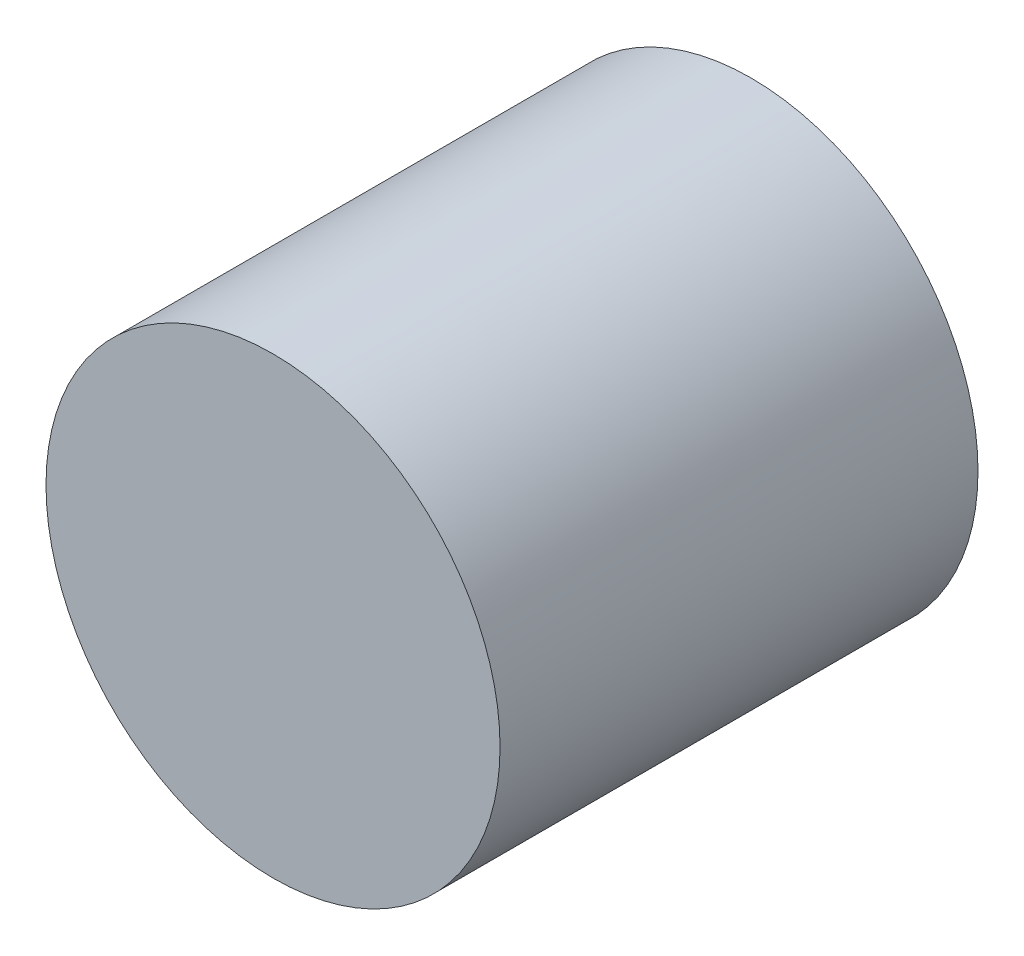
ISO-10303-21;
HEADER;
FILE_DESCRIPTION(('STEP AP214'),'2;1');
FILE_NAME('part.step','',(''),(''),'','','');
FILE_SCHEMA(('AUTOMOTIVE_DESIGN { 1 0 10303 214 1 1 1 1 }'));
ENDSEC;
DATA;
#1=APPLICATION_CONTEXT('core data for automotive mechanical design processes');
#2=APPLICATION_PROTOCOL_DEFINITION('international standard','automotive_design',2000,#1);
#3=PRODUCT_CONTEXT('',#1,'mechanical');
#4=PRODUCT('Part','Part','',(#3));
#5=PRODUCT_RELATED_PRODUCT_CATEGORY('part','',(#4));
#6=PRODUCT_DEFINITION_FORMATION('','',#4);
#7=PRODUCT_DEFINITION_CONTEXT('part definition',#1,'design');
#8=PRODUCT_DEFINITION('design','',#6,#7);
#9=PRODUCT_DEFINITION_SHAPE('','',#8);
#10=(LENGTH_UNIT() NAMED_UNIT(*) SI_UNIT(.MILLI.,.METRE.));
#11=(NAMED_UNIT(*) PLANE_ANGLE_UNIT() SI_UNIT($,.RADIAN.));
#12=(NAMED_UNIT(*) SI_UNIT($,.STERADIAN.) SOLID_ANGLE_UNIT());
#13=UNCERTAINTY_MEASURE_WITH_UNIT(LENGTH_MEASURE(1.E-05),#10,'distance_accuracy_value','');
#14=(GEOMETRIC_REPRESENTATION_CONTEXT(3) GLOBAL_UNCERTAINTY_ASSIGNED_CONTEXT((#13)) GLOBAL_UNIT_ASSIGNED_CONTEXT((#10,
#11,#12)) REPRESENTATION_CONTEXT('',''));
#15=CARTESIAN_POINT('',(0.,0.,0.));
#16=DIRECTION('',(0.,0.,1.));
#17=DIRECTION('',(1.,0.,0.));
#18=AXIS2_PLACEMENT_3D('',#15,#16,#17);
#19=CARTESIAN_POINT('',(0.,0.,5.08));
#20=DIRECTION('',(0.,0.,-1.));
#21=DIRECTION('',(-1.,0.,0.));
#22=AXIS2_PLACEMENT_3D('',#19,#20,#21);
#23=CYLINDRICAL_SURFACE('',#22,4.826);
#24=CARTESIAN_POINT('',(0.,0.,5.08));
#25=DIRECTION('',(0.,0.,1.));
#26=DIRECTION('',(1.,0.,0.));
#27=AXIS2_PLACEMENT_3D('',#24,#25,#26);
#28=CIRCLE('',#27,4.826);
#29=CARTESIAN_POINT('',(4.826,0.,5.08));
#30=VERTEX_POINT('',#29);
#31=EDGE_CURVE('E10',#30,#30,#28,.T.);
#32=ORIENTED_EDGE('',*,*,#31,.F.);
#33=EDGE_LOOP('',(#32));
#34=FACE_BOUND('',#33,.T.);
#35=CARTESIAN_POINT('',(0.,0.,-5.08));
#36=DIRECTION('',(0.,0.,1.));
#37=DIRECTION('',(1.,0.,0.));
#38=AXIS2_PLACEMENT_3D('',#35,#36,#37);
#39=CIRCLE('',#38,4.826);
#40=CARTESIAN_POINT('',(4.826,0.,-5.08));
#41=VERTEX_POINT('',#40);
#42=EDGE_CURVE('E37',#41,#41,#39,.T.);
#43=ORIENTED_EDGE('',*,*,#42,.T.);
#44=EDGE_LOOP('',(#43));
#45=FACE_BOUND('',#44,.T.);
#46=ADVANCED_FACE('F40',(#34,#45),#23,.T.);
#47=CARTESIAN_POINT('',(0.,0.,5.08));
#48=DIRECTION('',(0.,0.,1.));
#49=DIRECTION('',(1.,0.,0.));
#50=AXIS2_PLACEMENT_3D('',#47,#48,#49);
#51=PLANE('',#50);
#52=ORIENTED_EDGE('',*,*,#31,.T.);
#53=EDGE_LOOP('',(#52));
#54=FACE_BOUND('',#53,.T.);
#55=ADVANCED_FACE('F55',(#54),#51,.T.);
#56=CARTESIAN_POINT('',(0.,0.,-5.08));
#57=DIRECTION('',(0.,0.,1.));
#58=DIRECTION('',(1.,0.,0.));
#59=AXIS2_PLACEMENT_3D('',#56,#57,#58);
#60=PLANE('',#59);
#61=ORIENTED_EDGE('',*,*,#42,.F.);
#62=EDGE_LOOP('',(#61));
#63=FACE_BOUND('',#62,.T.);
#64=ADVANCED_FACE('F49',(#63),#60,.F.);
#65=CLOSED_SHELL('',(#46,#55,#64));
#66=MANIFOLD_SOLID_BREP('B2',#65);
#67=ADVANCED_BREP_SHAPE_REPRESENTATION('',(#18,#66),#14);
#68=SHAPE_DEFINITION_REPRESENTATION(#9,#67);
ENDSEC;
END-ISO-10303-21;
